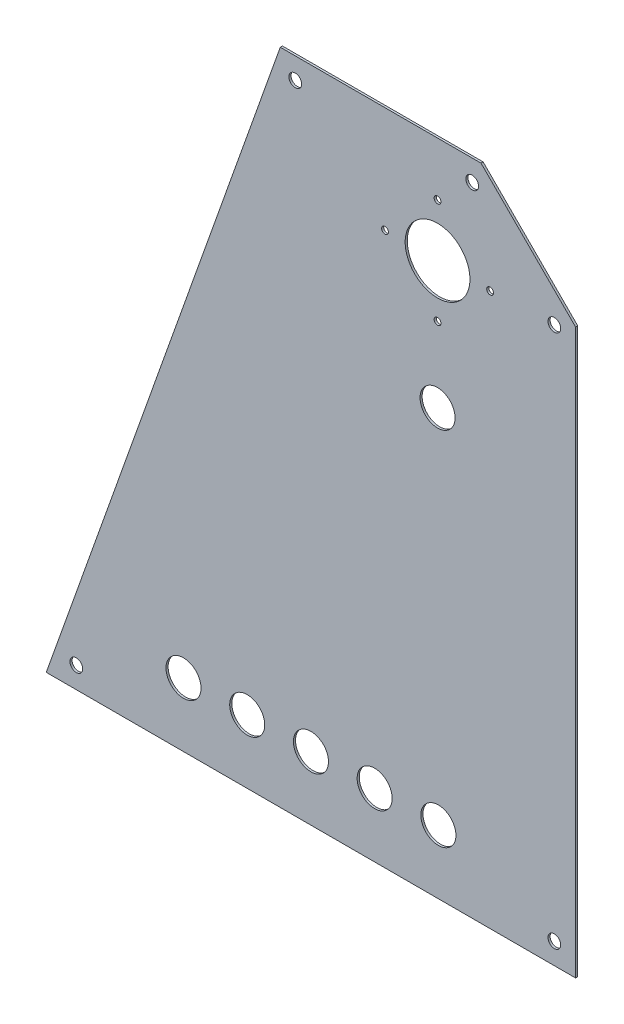
ISO-10303-21;
HEADER;
FILE_DESCRIPTION(('STEP AP214'),'2;1');
FILE_NAME('part.step','',(''),(''),'','','');
FILE_SCHEMA(('AUTOMOTIVE_DESIGN { 1 0 10303 214 1 1 1 1 }'));
ENDSEC;
DATA;
#1=APPLICATION_CONTEXT('core data for automotive mechanical design processes');
#2=APPLICATION_PROTOCOL_DEFINITION('international standard','automotive_design',2000,#1);
#3=PRODUCT_CONTEXT('',#1,'mechanical');
#4=PRODUCT('Part','Part','',(#3));
#5=PRODUCT_RELATED_PRODUCT_CATEGORY('part','',(#4));
#6=PRODUCT_DEFINITION_FORMATION('','',#4);
#7=PRODUCT_DEFINITION_CONTEXT('part definition',#1,'design');
#8=PRODUCT_DEFINITION('design','',#6,#7);
#9=PRODUCT_DEFINITION_SHAPE('','',#8);
#10=(LENGTH_UNIT() NAMED_UNIT(*) SI_UNIT(.MILLI.,.METRE.));
#11=(NAMED_UNIT(*) PLANE_ANGLE_UNIT() SI_UNIT($,.RADIAN.));
#12=(NAMED_UNIT(*) SI_UNIT($,.STERADIAN.) SOLID_ANGLE_UNIT());
#13=UNCERTAINTY_MEASURE_WITH_UNIT(LENGTH_MEASURE(1.E-05),#10,'distance_accuracy_value','');
#14=(GEOMETRIC_REPRESENTATION_CONTEXT(3) GLOBAL_UNCERTAINTY_ASSIGNED_CONTEXT((#13)) GLOBAL_UNIT_ASSIGNED_CONTEXT((#10,
#11,#12)) REPRESENTATION_CONTEXT('',''));
#15=CARTESIAN_POINT('',(0.,0.,0.));
#16=DIRECTION('',(0.,0.,1.));
#17=DIRECTION('',(1.,0.,0.));
#18=AXIS2_PLACEMENT_3D('',#15,#16,#17);
#19=CARTESIAN_POINT('',(125.,155.,-1.));
#20=DIRECTION('',(0.,-1.,0.));
#21=DIRECTION('',(0.,0.,1.));
#22=AXIS2_PLACEMENT_3D('',#19,#20,#21);
#23=PLANE('',#22);
#24=DIRECTION('',(-1.,0.,0.));
#25=VECTOR('',#24,1.);
#26=CARTESIAN_POINT('',(125.,155.,0.));
#27=LINE('',#26,#25);
#28=CARTESIAN_POINT('',(80.4522727852475,155.,0.));
#29=VERTEX_POINT('',#28);
#30=CARTESIAN_POINT('',(-14.0477272147525,155.,0.));
#31=VERTEX_POINT('',#30);
#32=EDGE_CURVE('E93',#29,#31,#27,.T.);
#33=ORIENTED_EDGE('',*,*,#32,.F.);
#34=DIRECTION('',(0.,0.,-1.));
#35=VECTOR('',#34,1.);
#36=CARTESIAN_POINT('',(80.4522727852475,155.,0.));
#37=LINE('',#36,#35);
#38=CARTESIAN_POINT('',(80.4522727852475,155.,-1.));
#39=VERTEX_POINT('',#38);
#40=EDGE_CURVE('E100',#29,#39,#37,.T.);
#41=ORIENTED_EDGE('',*,*,#40,.T.);
#42=DIRECTION('',(-1.,0.,0.));
#43=VECTOR('',#42,1.);
#44=CARTESIAN_POINT('',(125.,155.,-1.));
#45=LINE('',#44,#43);
#46=CARTESIAN_POINT('',(-14.0477272147525,155.,-1.));
#47=VERTEX_POINT('',#46);
#48=EDGE_CURVE('E109',#39,#47,#45,.T.);
#49=ORIENTED_EDGE('',*,*,#48,.T.);
#50=DIRECTION('',(0.,0.,-1.));
#51=VECTOR('',#50,1.);
#52=CARTESIAN_POINT('',(-14.0477272147525,155.,0.));
#53=LINE('',#52,#51);
#54=EDGE_CURVE('E94',#31,#47,#53,.T.);
#55=ORIENTED_EDGE('',*,*,#54,.F.);
#56=EDGE_LOOP('',(#33,#41,#49,#55));
#57=FACE_BOUND('',#56,.T.);
#58=ADVANCED_FACE('F41',(#57),#23,.F.);
#59=CARTESIAN_POINT('',(125.,-155.,-1.));
#60=DIRECTION('',(0.,1.,0.));
#61=DIRECTION('',(0.,0.,-1.));
#62=AXIS2_PLACEMENT_3D('',#59,#60,#61);
#63=PLANE('',#62);
#64=DIRECTION('',(0.,0.,-1.));
#65=VECTOR('',#64,1.);
#66=CARTESIAN_POINT('',(-124.233933247994,-155.,0.));
#67=LINE('',#66,#65);
#68=CARTESIAN_POINT('',(-124.233933247994,-155.,0.));
#69=VERTEX_POINT('',#68);
#70=CARTESIAN_POINT('',(-124.233933247994,-155.,-1.));
#71=VERTEX_POINT('',#70);
#72=EDGE_CURVE('E119',#69,#71,#67,.T.);
#73=ORIENTED_EDGE('',*,*,#72,.T.);
#74=DIRECTION('',(1.,0.,0.));
#75=VECTOR('',#74,1.);
#76=CARTESIAN_POINT('',(125.,-155.,-1.));
#77=LINE('',#76,#75);
#78=CARTESIAN_POINT('',(125.,-155.,-1.));
#79=VERTEX_POINT('',#78);
#80=EDGE_CURVE('E112',#71,#79,#77,.T.);
#81=ORIENTED_EDGE('',*,*,#80,.T.);
#82=DIRECTION('',(0.,0.,1.));
#83=VECTOR('',#82,1.);
#84=CARTESIAN_POINT('',(125.,-155.,-1.));
#85=LINE('',#84,#83);
#86=CARTESIAN_POINT('',(125.,-155.,0.));
#87=VERTEX_POINT('',#86);
#88=EDGE_CURVE('E11',#79,#87,#85,.T.);
#89=ORIENTED_EDGE('',*,*,#88,.T.);
#90=DIRECTION('',(1.,0.,0.));
#91=VECTOR('',#90,1.);
#92=CARTESIAN_POINT('',(125.,-155.,0.));
#93=LINE('',#92,#91);
#94=EDGE_CURVE('E104',#69,#87,#93,.T.);
#95=ORIENTED_EDGE('',*,*,#94,.F.);
#96=EDGE_LOOP('',(#73,#81,#89,#95));
#97=FACE_BOUND('',#96,.T.);
#98=ADVANCED_FACE('F280',(#97),#63,.F.);
#99=CARTESIAN_POINT('',(125.,-155.,-1.));
#100=DIRECTION('',(-1.,0.,0.));
#101=DIRECTION('',(0.,0.,-1.));
#102=AXIS2_PLACEMENT_3D('',#99,#100,#101);
#103=PLANE('',#102);
#104=DIRECTION('',(0.,1.,0.));
#105=VECTOR('',#104,1.);
#106=CARTESIAN_POINT('',(125.,-155.,0.));
#107=LINE('',#106,#105);
#108=CARTESIAN_POINT('',(125.,110.452272785248,0.));
#109=VERTEX_POINT('',#108);
#110=EDGE_CURVE('E91',#87,#109,#107,.T.);
#111=ORIENTED_EDGE('',*,*,#110,.F.);
#112=ORIENTED_EDGE('',*,*,#88,.F.);
#113=DIRECTION('',(0.,1.,0.));
#114=VECTOR('',#113,1.);
#115=CARTESIAN_POINT('',(125.,-155.,-1.));
#116=LINE('',#115,#114);
#117=CARTESIAN_POINT('',(125.,110.452272785248,-1.));
#118=VERTEX_POINT('',#117);
#119=EDGE_CURVE('E48',#79,#118,#116,.T.);
#120=ORIENTED_EDGE('',*,*,#119,.T.);
#121=DIRECTION('',(0.,0.,-1.));
#122=VECTOR('',#121,1.);
#123=CARTESIAN_POINT('',(125.,110.452272785248,0.));
#124=LINE('',#123,#122);
#125=EDGE_CURVE('E103',#109,#118,#124,.T.);
#126=ORIENTED_EDGE('',*,*,#125,.F.);
#127=EDGE_LOOP('',(#111,#112,#120,#126));
#128=FACE_BOUND('',#127,.T.);
#129=ADVANCED_FACE('F268',(#128),#103,.F.);
#130=CARTESIAN_POINT('',(0.,0.,-1.));
#131=DIRECTION('',(0.,0.,1.));
#132=DIRECTION('',(-1.,0.,0.));
#133=AXIS2_PLACEMENT_3D('',#130,#131,#132);
#134=PLANE('',#133);
#135=CARTESIAN_POINT('',(-110.06663627918,-145.,-1.));
#136=DIRECTION('',(0.,0.,1.));
#137=DIRECTION('',(1.,0.,0.));
#138=AXIS2_PLACEMENT_3D('',#135,#136,#137);
#139=CIRCLE('',#138,2.99999999999999);
#140=CARTESIAN_POINT('',(-107.06663627918,-145.,-1.));
#141=VERTEX_POINT('',#140);
#142=EDGE_CURVE('E214',#141,#141,#139,.T.);
#143=ORIENTED_EDGE('',*,*,#142,.T.);
#144=EDGE_LOOP('',(#143));
#145=FACE_BOUND('',#144,.T.);
#146=CARTESIAN_POINT('',(-6.98921773195385,145.,-1.));
#147=DIRECTION('',(0.,0.,1.));
#148=DIRECTION('',(1.,0.,0.));
#149=AXIS2_PLACEMENT_3D('',#146,#147,#148);
#150=CIRCLE('',#149,2.99999999999999);
#151=CARTESIAN_POINT('',(-3.98921773195385,145.,-1.));
#152=VERTEX_POINT('',#151);
#153=EDGE_CURVE('E215',#152,#152,#150,.T.);
#154=ORIENTED_EDGE('',*,*,#153,.T.);
#155=EDGE_LOOP('',(#154));
#156=FACE_BOUND('',#155,.T.);
#157=CARTESIAN_POINT('',(76.3101371615166,145.,-1.));
#158=DIRECTION('',(0.,0.,1.));
#159=DIRECTION('',(1.,0.,0.));
#160=AXIS2_PLACEMENT_3D('',#157,#158,#159);
#161=CIRCLE('',#160,2.99999999999999);
#162=CARTESIAN_POINT('',(79.3101371615166,145.,-1.));
#163=VERTEX_POINT('',#162);
#164=EDGE_CURVE('E206',#163,#163,#161,.T.);
#165=ORIENTED_EDGE('',*,*,#164,.T.);
#166=EDGE_LOOP('',(#165));
#167=FACE_BOUND('',#166,.T.);
#168=CARTESIAN_POINT('',(115.,-145.,-1.));
#169=DIRECTION('',(0.,0.,1.));
#170=DIRECTION('',(1.,0.,0.));
#171=AXIS2_PLACEMENT_3D('',#168,#169,#170);
#172=CIRCLE('',#171,2.99999999999999);
#173=CARTESIAN_POINT('',(118.,-145.,-1.));
#174=VERTEX_POINT('',#173);
#175=EDGE_CURVE('E199',#174,#174,#172,.T.);
#176=ORIENTED_EDGE('',*,*,#175,.T.);
#177=EDGE_LOOP('',(#176));
#178=FACE_BOUND('',#177,.T.);
#179=CARTESIAN_POINT('',(115.,106.310137161517,-1.));
#180=DIRECTION('',(0.,0.,1.));
#181=DIRECTION('',(1.,0.,0.));
#182=AXIS2_PLACEMENT_3D('',#179,#180,#181);
#183=CIRCLE('',#182,3.00000000000001);
#184=CARTESIAN_POINT('',(118.,106.310137161517,-1.));
#185=VERTEX_POINT('',#184);
#186=EDGE_CURVE('E193',#185,#185,#183,.T.);
#187=ORIENTED_EDGE('',*,*,#186,.T.);
#188=EDGE_LOOP('',(#187));
#189=FACE_BOUND('',#188,.T.);
#190=CARTESIAN_POINT('',(-59.6169666239971,-125.,-1.));
#191=DIRECTION('',(0.,0.,1.));
#192=DIRECTION('',(1.,0.,0.));
#193=AXIS2_PLACEMENT_3D('',#190,#191,#192);
#194=CIRCLE('',#193,8.25);
#195=CARTESIAN_POINT('',(-51.3669666239971,-125.,-1.));
#196=VERTEX_POINT('',#195);
#197=EDGE_CURVE('E189',#196,#196,#194,.T.);
#198=ORIENTED_EDGE('',*,*,#197,.T.);
#199=EDGE_LOOP('',(#198));
#200=FACE_BOUND('',#199,.T.);
#201=CARTESIAN_POINT('',(-29.6169666239971,-125.,-1.));
#202=DIRECTION('',(0.,0.,1.));
#203=DIRECTION('',(1.,0.,0.));
#204=AXIS2_PLACEMENT_3D('',#201,#202,#203);
#205=CIRCLE('',#204,8.25);
#206=CARTESIAN_POINT('',(-21.3669666239971,-125.,-1.));
#207=VERTEX_POINT('',#206);
#208=EDGE_CURVE('E181',#207,#207,#205,.T.);
#209=ORIENTED_EDGE('',*,*,#208,.T.);
#210=EDGE_LOOP('',(#209));
#211=FACE_BOUND('',#210,.T.);
#212=CARTESIAN_POINT('',(0.383033376002859,-125.,-1.));
#213=DIRECTION('',(0.,0.,1.));
#214=DIRECTION('',(1.,0.,0.));
#215=AXIS2_PLACEMENT_3D('',#212,#213,#214);
#216=CIRCLE('',#215,8.25);
#217=CARTESIAN_POINT('',(8.63303337600286,-125.,-1.));
#218=VERTEX_POINT('',#217);
#219=EDGE_CURVE('E180',#218,#218,#216,.T.);
#220=ORIENTED_EDGE('',*,*,#219,.T.);
#221=EDGE_LOOP('',(#220));
#222=FACE_BOUND('',#221,.T.);
#223=CARTESIAN_POINT('',(30.3830333760029,-125.,-1.));
#224=DIRECTION('',(0.,0.,1.));
#225=DIRECTION('',(1.,0.,0.));
#226=AXIS2_PLACEMENT_3D('',#223,#224,#225);
#227=CIRCLE('',#226,8.25);
#228=CARTESIAN_POINT('',(38.6330333760028,-125.,-1.));
#229=VERTEX_POINT('',#228);
#230=EDGE_CURVE('E174',#229,#229,#227,.T.);
#231=ORIENTED_EDGE('',*,*,#230,.T.);
#232=EDGE_LOOP('',(#231));
#233=FACE_BOUND('',#232,.T.);
#234=CARTESIAN_POINT('',(60.3830333760029,-125.,-1.));
#235=DIRECTION('',(0.,0.,1.));
#236=DIRECTION('',(1.,0.,0.));
#237=AXIS2_PLACEMENT_3D('',#234,#235,#236);
#238=CIRCLE('',#237,8.25);
#239=CARTESIAN_POINT('',(68.6330333760029,-125.,-1.));
#240=VERTEX_POINT('',#239);
#241=EDGE_CURVE('E163',#240,#240,#238,.T.);
#242=ORIENTED_EDGE('',*,*,#241,.T.);
#243=EDGE_LOOP('',(#242));
#244=FACE_BOUND('',#243,.T.);
#245=CARTESIAN_POINT('',(35.2512626584709,105.,-1.));
#246=DIRECTION('',(0.,0.,1.));
#247=DIRECTION('',(1.,0.,0.));
#248=AXIS2_PLACEMENT_3D('',#245,#246,#247);
#249=CIRCLE('',#248,1.60000000000001);
#250=CARTESIAN_POINT('',(36.8512626584709,105.,-1.));
#251=VERTEX_POINT('',#250);
#252=EDGE_CURVE('E148',#251,#251,#249,.T.);
#253=ORIENTED_EDGE('',*,*,#252,.T.);
#254=EDGE_LOOP('',(#253));
#255=FACE_BOUND('',#254,.T.);
#256=CARTESIAN_POINT('',(84.7487373415291,105.,-1.));
#257=DIRECTION('',(0.,0.,1.));
#258=DIRECTION('',(1.,0.,0.));
#259=AXIS2_PLACEMENT_3D('',#256,#257,#258);
#260=CIRCLE('',#259,1.59999999999993);
#261=CARTESIAN_POINT('',(86.348737341529,105.,-1.));
#262=VERTEX_POINT('',#261);
#263=EDGE_CURVE('E132',#262,#262,#260,.T.);
#264=ORIENTED_EDGE('',*,*,#263,.T.);
#265=EDGE_LOOP('',(#264));
#266=FACE_BOUND('',#265,.T.);
#267=CARTESIAN_POINT('',(60.,129.748737341529,-1.));
#268=DIRECTION('',(0.,0.,1.));
#269=DIRECTION('',(1.,0.,0.));
#270=AXIS2_PLACEMENT_3D('',#267,#268,#269);
#271=CIRCLE('',#270,1.59999999999999);
#272=CARTESIAN_POINT('',(61.6,129.748737341529,-1.));
#273=VERTEX_POINT('',#272);
#274=EDGE_CURVE('E133',#273,#273,#271,.T.);
#275=ORIENTED_EDGE('',*,*,#274,.T.);
#276=EDGE_LOOP('',(#275));
#277=FACE_BOUND('',#276,.T.);
#278=CARTESIAN_POINT('',(60.,45.,-1.));
#279=DIRECTION('',(0.,0.,1.));
#280=DIRECTION('',(1.,0.,0.));
#281=AXIS2_PLACEMENT_3D('',#278,#279,#280);
#282=CIRCLE('',#281,8.25);
#283=CARTESIAN_POINT('',(68.25,45.,-1.));
#284=VERTEX_POINT('',#283);
#285=EDGE_CURVE('E126',#284,#284,#282,.T.);
#286=ORIENTED_EDGE('',*,*,#285,.T.);
#287=EDGE_LOOP('',(#286));
#288=FACE_BOUND('',#287,.T.);
#289=CARTESIAN_POINT('',(59.9999999999999,80.2512626584708,-1.));
#290=DIRECTION('',(0.,0.,1.));
#291=DIRECTION('',(1.,0.,0.));
#292=AXIS2_PLACEMENT_3D('',#289,#290,#291);
#293=CIRCLE('',#292,1.60000000000005);
#294=CARTESIAN_POINT('',(61.6,80.2512626584708,-1.));
#295=VERTEX_POINT('',#294);
#296=EDGE_CURVE('E150',#295,#295,#293,.T.);
#297=ORIENTED_EDGE('',*,*,#296,.T.);
#298=EDGE_LOOP('',(#297));
#299=FACE_BOUND('',#298,.T.);
#300=CARTESIAN_POINT('',(60.,105.,-1.));
#301=DIRECTION('',(0.,0.,1.));
#302=DIRECTION('',(1.,0.,0.));
#303=AXIS2_PLACEMENT_3D('',#300,#301,#302);
#304=CIRCLE('',#303,15.25);
#305=CARTESIAN_POINT('',(75.25,105.,-1.));
#306=VERTEX_POINT('',#305);
#307=EDGE_CURVE('E124',#306,#306,#304,.T.);
#308=ORIENTED_EDGE('',*,*,#307,.T.);
#309=EDGE_LOOP('',(#308));
#310=FACE_BOUND('',#309,.T.);
#311=ORIENTED_EDGE('',*,*,#119,.F.);
#312=ORIENTED_EDGE('',*,*,#80,.F.);
#313=DIRECTION('',(-0.3349124803442,-0.942249240121581,0.));
#314=VECTOR('',#313,1.);
#315=CARTESIAN_POINT('',(-14.0477272147525,155.,-1.));
#316=LINE('',#315,#314);
#317=EDGE_CURVE('E121',#47,#71,#316,.T.);
#318=ORIENTED_EDGE('',*,*,#317,.F.);
#319=ORIENTED_EDGE('',*,*,#48,.F.);
#320=DIRECTION('',(-0.707106781186547,0.707106781186547,0.));
#321=VECTOR('',#320,1.);
#322=CARTESIAN_POINT('',(125.,110.452272785248,-1.));
#323=LINE('',#322,#321);
#324=EDGE_CURVE('E97',#118,#39,#323,.T.);
#325=ORIENTED_EDGE('',*,*,#324,.F.);
#326=EDGE_LOOP('',(#311,#312,#318,#319,#325));
#327=FACE_BOUND('',#326,.T.);
#328=ADVANCED_FACE('F226',(#145,#156,#167,#178,#189,#200,#211,#222,#233,#244,#255,#266,#277,
#288,#299,#310,#327),#134,.F.);
#329=CARTESIAN_POINT('',(0.,0.,0.));
#330=DIRECTION('',(0.,0.,1.));
#331=DIRECTION('',(-1.,0.,0.));
#332=AXIS2_PLACEMENT_3D('',#329,#330,#331);
#333=PLANE('',#332);
#334=CARTESIAN_POINT('',(-110.06663627918,-145.,0.));
#335=DIRECTION('',(0.,0.,1.));
#336=DIRECTION('',(1.,0.,0.));
#337=AXIS2_PLACEMENT_3D('',#334,#335,#336);
#338=CIRCLE('',#337,2.99999999999999);
#339=CARTESIAN_POINT('',(-107.06663627918,-145.,0.));
#340=VERTEX_POINT('',#339);
#341=EDGE_CURVE('E164',#340,#340,#338,.T.);
#342=ORIENTED_EDGE('',*,*,#341,.F.);
#343=EDGE_LOOP('',(#342));
#344=FACE_BOUND('',#343,.T.);
#345=CARTESIAN_POINT('',(-6.98921773195385,145.,0.));
#346=DIRECTION('',(0.,0.,1.));
#347=DIRECTION('',(1.,0.,0.));
#348=AXIS2_PLACEMENT_3D('',#345,#346,#347);
#349=CIRCLE('',#348,2.99999999999999);
#350=CARTESIAN_POINT('',(-3.98921773195385,145.,0.));
#351=VERTEX_POINT('',#350);
#352=EDGE_CURVE('E207',#351,#351,#349,.T.);
#353=ORIENTED_EDGE('',*,*,#352,.F.);
#354=EDGE_LOOP('',(#353));
#355=FACE_BOUND('',#354,.T.);
#356=CARTESIAN_POINT('',(76.3101371615166,145.,0.));
#357=DIRECTION('',(0.,0.,1.));
#358=DIRECTION('',(1.,0.,0.));
#359=AXIS2_PLACEMENT_3D('',#356,#357,#358);
#360=CIRCLE('',#359,2.99999999999999);
#361=CARTESIAN_POINT('',(79.3101371615166,145.,0.));
#362=VERTEX_POINT('',#361);
#363=EDGE_CURVE('E201',#362,#362,#360,.T.);
#364=ORIENTED_EDGE('',*,*,#363,.F.);
#365=EDGE_LOOP('',(#364));
#366=FACE_BOUND('',#365,.T.);
#367=CARTESIAN_POINT('',(115.,-145.,0.));
#368=DIRECTION('',(0.,0.,1.));
#369=DIRECTION('',(1.,0.,0.));
#370=AXIS2_PLACEMENT_3D('',#367,#368,#369);
#371=CIRCLE('',#370,2.99999999999999);
#372=CARTESIAN_POINT('',(118.,-145.,0.));
#373=VERTEX_POINT('',#372);
#374=EDGE_CURVE('E197',#373,#373,#371,.T.);
#375=ORIENTED_EDGE('',*,*,#374,.F.);
#376=EDGE_LOOP('',(#375));
#377=FACE_BOUND('',#376,.T.);
#378=CARTESIAN_POINT('',(115.,106.310137161517,0.));
#379=DIRECTION('',(0.,0.,1.));
#380=DIRECTION('',(1.,0.,0.));
#381=AXIS2_PLACEMENT_3D('',#378,#379,#380);
#382=CIRCLE('',#381,3.00000000000001);
#383=CARTESIAN_POINT('',(118.,106.310137161517,0.));
#384=VERTEX_POINT('',#383);
#385=EDGE_CURVE('E191',#384,#384,#382,.T.);
#386=ORIENTED_EDGE('',*,*,#385,.F.);
#387=EDGE_LOOP('',(#386));
#388=FACE_BOUND('',#387,.T.);
#389=CARTESIAN_POINT('',(-59.6169666239971,-125.,0.));
#390=DIRECTION('',(0.,0.,1.));
#391=DIRECTION('',(1.,0.,0.));
#392=AXIS2_PLACEMENT_3D('',#389,#390,#391);
#393=CIRCLE('',#392,8.25);
#394=CARTESIAN_POINT('',(-51.3669666239971,-125.,0.));
#395=VERTEX_POINT('',#394);
#396=EDGE_CURVE('E158',#395,#395,#393,.T.);
#397=ORIENTED_EDGE('',*,*,#396,.F.);
#398=EDGE_LOOP('',(#397));
#399=FACE_BOUND('',#398,.T.);
#400=CARTESIAN_POINT('',(-29.6169666239971,-125.,0.));
#401=DIRECTION('',(0.,0.,1.));
#402=DIRECTION('',(1.,0.,0.));
#403=AXIS2_PLACEMENT_3D('',#400,#401,#402);
#404=CIRCLE('',#403,8.25);
#405=CARTESIAN_POINT('',(-21.3669666239971,-125.,0.));
#406=VERTEX_POINT('',#405);
#407=EDGE_CURVE('E179',#406,#406,#404,.T.);
#408=ORIENTED_EDGE('',*,*,#407,.F.);
#409=EDGE_LOOP('',(#408));
#410=FACE_BOUND('',#409,.T.);
#411=CARTESIAN_POINT('',(0.383033376002859,-125.,0.));
#412=DIRECTION('',(0.,0.,1.));
#413=DIRECTION('',(1.,0.,0.));
#414=AXIS2_PLACEMENT_3D('',#411,#412,#413);
#415=CIRCLE('',#414,8.25);
#416=CARTESIAN_POINT('',(8.63303337600286,-125.,0.));
#417=VERTEX_POINT('',#416);
#418=EDGE_CURVE('E173',#417,#417,#415,.T.);
#419=ORIENTED_EDGE('',*,*,#418,.F.);
#420=EDGE_LOOP('',(#419));
#421=FACE_BOUND('',#420,.T.);
#422=CARTESIAN_POINT('',(30.3830333760029,-125.,0.));
#423=DIRECTION('',(0.,0.,1.));
#424=DIRECTION('',(1.,0.,0.));
#425=AXIS2_PLACEMENT_3D('',#422,#423,#424);
#426=CIRCLE('',#425,8.25);
#427=CARTESIAN_POINT('',(38.6330333760028,-125.,0.));
#428=VERTEX_POINT('',#427);
#429=EDGE_CURVE('E169',#428,#428,#426,.T.);
#430=ORIENTED_EDGE('',*,*,#429,.F.);
#431=EDGE_LOOP('',(#430));
#432=FACE_BOUND('',#431,.T.);
#433=CARTESIAN_POINT('',(60.3830333760029,-125.,0.));
#434=DIRECTION('',(0.,0.,1.));
#435=DIRECTION('',(1.,0.,0.));
#436=AXIS2_PLACEMENT_3D('',#433,#434,#435);
#437=CIRCLE('',#436,8.25);
#438=CARTESIAN_POINT('',(68.6330333760029,-125.,0.));
#439=VERTEX_POINT('',#438);
#440=EDGE_CURVE('E161',#439,#439,#437,.T.);
#441=ORIENTED_EDGE('',*,*,#440,.F.);
#442=EDGE_LOOP('',(#441));
#443=FACE_BOUND('',#442,.T.);
#444=CARTESIAN_POINT('',(35.2512626584709,105.,0.));
#445=DIRECTION('',(0.,0.,1.));
#446=DIRECTION('',(1.,0.,0.));
#447=AXIS2_PLACEMENT_3D('',#444,#445,#446);
#448=CIRCLE('',#447,1.60000000000001);
#449=CARTESIAN_POINT('',(36.8512626584709,105.,0.));
#450=VERTEX_POINT('',#449);
#451=EDGE_CURVE('E141',#450,#450,#448,.T.);
#452=ORIENTED_EDGE('',*,*,#451,.F.);
#453=EDGE_LOOP('',(#452));
#454=FACE_BOUND('',#453,.T.);
#455=CARTESIAN_POINT('',(84.7487373415291,105.,0.));
#456=DIRECTION('',(0.,0.,1.));
#457=DIRECTION('',(1.,0.,0.));
#458=AXIS2_PLACEMENT_3D('',#455,#456,#457);
#459=CIRCLE('',#458,1.59999999999993);
#460=CARTESIAN_POINT('',(86.348737341529,105.,0.));
#461=VERTEX_POINT('',#460);
#462=EDGE_CURVE('E147',#461,#461,#459,.T.);
#463=ORIENTED_EDGE('',*,*,#462,.F.);
#464=EDGE_LOOP('',(#463));
#465=FACE_BOUND('',#464,.T.);
#466=CARTESIAN_POINT('',(60.,129.748737341529,0.));
#467=DIRECTION('',(0.,0.,1.));
#468=DIRECTION('',(1.,0.,0.));
#469=AXIS2_PLACEMENT_3D('',#466,#467,#468);
#470=CIRCLE('',#469,1.59999999999999);
#471=CARTESIAN_POINT('',(61.6,129.748737341529,0.));
#472=VERTEX_POINT('',#471);
#473=EDGE_CURVE('E134',#472,#472,#470,.T.);
#474=ORIENTED_EDGE('',*,*,#473,.F.);
#475=EDGE_LOOP('',(#474));
#476=FACE_BOUND('',#475,.T.);
#477=CARTESIAN_POINT('',(60.,45.,0.));
#478=DIRECTION('',(0.,0.,1.));
#479=DIRECTION('',(1.,0.,0.));
#480=AXIS2_PLACEMENT_3D('',#477,#478,#479);
#481=CIRCLE('',#480,8.25);
#482=CARTESIAN_POINT('',(68.25,45.,0.));
#483=VERTEX_POINT('',#482);
#484=EDGE_CURVE('E137',#483,#483,#481,.T.);
#485=ORIENTED_EDGE('',*,*,#484,.F.);
#486=EDGE_LOOP('',(#485));
#487=FACE_BOUND('',#486,.T.);
#488=CARTESIAN_POINT('',(59.9999999999999,80.2512626584708,0.));
#489=DIRECTION('',(0.,0.,1.));
#490=DIRECTION('',(1.,0.,0.));
#491=AXIS2_PLACEMENT_3D('',#488,#489,#490);
#492=CIRCLE('',#491,1.60000000000005);
#493=CARTESIAN_POINT('',(61.6,80.2512626584708,0.));
#494=VERTEX_POINT('',#493);
#495=EDGE_CURVE('E154',#494,#494,#492,.T.);
#496=ORIENTED_EDGE('',*,*,#495,.F.);
#497=EDGE_LOOP('',(#496));
#498=FACE_BOUND('',#497,.T.);
#499=CARTESIAN_POINT('',(60.,105.,0.));
#500=DIRECTION('',(0.,0.,1.));
#501=DIRECTION('',(1.,0.,0.));
#502=AXIS2_PLACEMENT_3D('',#499,#500,#501);
#503=CIRCLE('',#502,15.25);
#504=CARTESIAN_POINT('',(75.25,105.,0.));
#505=VERTEX_POINT('',#504);
#506=EDGE_CURVE('E125',#505,#505,#503,.T.);
#507=ORIENTED_EDGE('',*,*,#506,.F.);
#508=EDGE_LOOP('',(#507));
#509=FACE_BOUND('',#508,.T.);
#510=DIRECTION('',(-0.707106781186547,0.707106781186547,0.));
#511=VECTOR('',#510,1.);
#512=CARTESIAN_POINT('',(125.,110.452272785248,0.));
#513=LINE('',#512,#511);
#514=EDGE_CURVE('E65',#109,#29,#513,.T.);
#515=ORIENTED_EDGE('',*,*,#514,.T.);
#516=ORIENTED_EDGE('',*,*,#32,.T.);
#517=DIRECTION('',(-0.3349124803442,-0.942249240121581,0.));
#518=VECTOR('',#517,1.);
#519=CARTESIAN_POINT('',(-14.0477272147525,155.,0.));
#520=LINE('',#519,#518);
#521=EDGE_CURVE('E54',#31,#69,#520,.T.);
#522=ORIENTED_EDGE('',*,*,#521,.T.);
#523=ORIENTED_EDGE('',*,*,#94,.T.);
#524=ORIENTED_EDGE('',*,*,#110,.T.);
#525=EDGE_LOOP('',(#515,#516,#522,#523,#524));
#526=FACE_BOUND('',#525,.T.);
#527=ADVANCED_FACE('F90',(#344,#355,#366,#377,#388,#399,#410,#421,#432,#443,#454,#465,#476,#487,
#498,#509,#526),#333,.T.);
#528=CARTESIAN_POINT('',(-14.0477272147525,155.,0.));
#529=DIRECTION('',(-0.942249240121581,0.3349124803442,0.));
#530=DIRECTION('',(-0.3349124803442,-0.942249240121581,0.));
#531=AXIS2_PLACEMENT_3D('',#528,#529,#530);
#532=PLANE('',#531);
#533=ORIENTED_EDGE('',*,*,#317,.T.);
#534=ORIENTED_EDGE('',*,*,#72,.F.);
#535=ORIENTED_EDGE('',*,*,#521,.F.);
#536=ORIENTED_EDGE('',*,*,#54,.T.);
#537=EDGE_LOOP('',(#533,#534,#535,#536));
#538=FACE_BOUND('',#537,.T.);
#539=ADVANCED_FACE('F229',(#538),#532,.T.);
#540=CARTESIAN_POINT('',(125.,110.452272785248,0.));
#541=DIRECTION('',(0.707106781186547,0.707106781186547,0.));
#542=DIRECTION('',(-0.707106781186548,0.707106781186548,0.));
#543=AXIS2_PLACEMENT_3D('',#540,#541,#542);
#544=PLANE('',#543);
#545=ORIENTED_EDGE('',*,*,#324,.T.);
#546=ORIENTED_EDGE('',*,*,#40,.F.);
#547=ORIENTED_EDGE('',*,*,#514,.F.);
#548=ORIENTED_EDGE('',*,*,#125,.T.);
#549=EDGE_LOOP('',(#545,#546,#547,#548));
#550=FACE_BOUND('',#549,.T.);
#551=ADVANCED_FACE('F98',(#550),#544,.T.);
#552=CARTESIAN_POINT('',(60.,105.,0.));
#553=DIRECTION('',(0.,0.,-1.));
#554=DIRECTION('',(1.,0.,0.));
#555=AXIS2_PLACEMENT_3D('',#552,#553,#554);
#556=CYLINDRICAL_SURFACE('',#555,15.25);
#557=ORIENTED_EDGE('',*,*,#506,.T.);
#558=EDGE_LOOP('',(#557));
#559=FACE_BOUND('',#558,.T.);
#560=ORIENTED_EDGE('',*,*,#307,.F.);
#561=EDGE_LOOP('',(#560));
#562=FACE_BOUND('',#561,.T.);
#563=ADVANCED_FACE('F259',(#559,#562),#556,.F.);
#564=CARTESIAN_POINT('',(59.9999999999999,80.2512626584708,0.));
#565=DIRECTION('',(0.,0.,-1.));
#566=DIRECTION('',(1.,0.,0.));
#567=AXIS2_PLACEMENT_3D('',#564,#565,#566);
#568=CYLINDRICAL_SURFACE('',#567,1.60000000000005);
#569=ORIENTED_EDGE('',*,*,#495,.T.);
#570=EDGE_LOOP('',(#569));
#571=FACE_BOUND('',#570,.T.);
#572=ORIENTED_EDGE('',*,*,#296,.F.);
#573=EDGE_LOOP('',(#572));
#574=FACE_BOUND('',#573,.T.);
#575=ADVANCED_FACE('F265',(#571,#574),#568,.F.);
#576=CARTESIAN_POINT('',(60.,45.,0.));
#577=DIRECTION('',(0.,0.,-1.));
#578=DIRECTION('',(1.,0.,0.));
#579=AXIS2_PLACEMENT_3D('',#576,#577,#578);
#580=CYLINDRICAL_SURFACE('',#579,8.25);
#581=ORIENTED_EDGE('',*,*,#484,.T.);
#582=EDGE_LOOP('',(#581));
#583=FACE_BOUND('',#582,.T.);
#584=ORIENTED_EDGE('',*,*,#285,.F.);
#585=EDGE_LOOP('',(#584));
#586=FACE_BOUND('',#585,.T.);
#587=ADVANCED_FACE('F332',(#583,#586),#580,.F.);
#588=CARTESIAN_POINT('',(60.,129.748737341529,0.));
#589=DIRECTION('',(0.,0.,-1.));
#590=DIRECTION('',(1.,0.,0.));
#591=AXIS2_PLACEMENT_3D('',#588,#589,#590);
#592=CYLINDRICAL_SURFACE('',#591,1.59999999999999);
#593=ORIENTED_EDGE('',*,*,#473,.T.);
#594=EDGE_LOOP('',(#593));
#595=FACE_BOUND('',#594,.T.);
#596=ORIENTED_EDGE('',*,*,#274,.F.);
#597=EDGE_LOOP('',(#596));
#598=FACE_BOUND('',#597,.T.);
#599=ADVANCED_FACE('F341',(#595,#598),#592,.F.);
#600=CARTESIAN_POINT('',(84.7487373415291,105.,0.));
#601=DIRECTION('',(0.,0.,-1.));
#602=DIRECTION('',(1.,0.,0.));
#603=AXIS2_PLACEMENT_3D('',#600,#601,#602);
#604=CYLINDRICAL_SURFACE('',#603,1.59999999999993);
#605=ORIENTED_EDGE('',*,*,#462,.T.);
#606=EDGE_LOOP('',(#605));
#607=FACE_BOUND('',#606,.T.);
#608=ORIENTED_EDGE('',*,*,#263,.F.);
#609=EDGE_LOOP('',(#608));
#610=FACE_BOUND('',#609,.T.);
#611=ADVANCED_FACE('F354',(#607,#610),#604,.F.);
#612=CARTESIAN_POINT('',(35.2512626584709,105.,0.));
#613=DIRECTION('',(0.,0.,-1.));
#614=DIRECTION('',(1.,0.,0.));
#615=AXIS2_PLACEMENT_3D('',#612,#613,#614);
#616=CYLINDRICAL_SURFACE('',#615,1.60000000000001);
#617=ORIENTED_EDGE('',*,*,#451,.T.);
#618=EDGE_LOOP('',(#617));
#619=FACE_BOUND('',#618,.T.);
#620=ORIENTED_EDGE('',*,*,#252,.F.);
#621=EDGE_LOOP('',(#620));
#622=FACE_BOUND('',#621,.T.);
#623=ADVANCED_FACE('F363',(#619,#622),#616,.F.);
#624=CARTESIAN_POINT('',(60.3830333760029,-125.,0.));
#625=DIRECTION('',(0.,0.,-1.));
#626=DIRECTION('',(1.,0.,0.));
#627=AXIS2_PLACEMENT_3D('',#624,#625,#626);
#628=CYLINDRICAL_SURFACE('',#627,8.25);
#629=ORIENTED_EDGE('',*,*,#440,.T.);
#630=EDGE_LOOP('',(#629));
#631=FACE_BOUND('',#630,.T.);
#632=ORIENTED_EDGE('',*,*,#241,.F.);
#633=EDGE_LOOP('',(#632));
#634=FACE_BOUND('',#633,.T.);
#635=ADVANCED_FACE('F371',(#631,#634),#628,.F.);
#636=CARTESIAN_POINT('',(30.3830333760029,-125.,0.));
#637=DIRECTION('',(0.,0.,-1.));
#638=DIRECTION('',(1.,0.,0.));
#639=AXIS2_PLACEMENT_3D('',#636,#637,#638);
#640=CYLINDRICAL_SURFACE('',#639,8.25);
#641=ORIENTED_EDGE('',*,*,#429,.T.);
#642=EDGE_LOOP('',(#641));
#643=FACE_BOUND('',#642,.T.);
#644=ORIENTED_EDGE('',*,*,#230,.F.);
#645=EDGE_LOOP('',(#644));
#646=FACE_BOUND('',#645,.T.);
#647=ADVANCED_FACE('F381',(#643,#646),#640,.F.);
#648=CARTESIAN_POINT('',(0.383033376002859,-125.,0.));
#649=DIRECTION('',(0.,0.,-1.));
#650=DIRECTION('',(1.,0.,0.));
#651=AXIS2_PLACEMENT_3D('',#648,#649,#650);
#652=CYLINDRICAL_SURFACE('',#651,8.25);
#653=ORIENTED_EDGE('',*,*,#418,.T.);
#654=EDGE_LOOP('',(#653));
#655=FACE_BOUND('',#654,.T.);
#656=ORIENTED_EDGE('',*,*,#219,.F.);
#657=EDGE_LOOP('',(#656));
#658=FACE_BOUND('',#657,.T.);
#659=ADVANCED_FACE('F394',(#655,#658),#652,.F.);
#660=CARTESIAN_POINT('',(-29.6169666239971,-125.,0.));
#661=DIRECTION('',(0.,0.,-1.));
#662=DIRECTION('',(1.,0.,0.));
#663=AXIS2_PLACEMENT_3D('',#660,#661,#662);
#664=CYLINDRICAL_SURFACE('',#663,8.25);
#665=ORIENTED_EDGE('',*,*,#407,.T.);
#666=EDGE_LOOP('',(#665));
#667=FACE_BOUND('',#666,.T.);
#668=ORIENTED_EDGE('',*,*,#208,.F.);
#669=EDGE_LOOP('',(#668));
#670=FACE_BOUND('',#669,.T.);
#671=ADVANCED_FACE('F402',(#667,#670),#664,.F.);
#672=CARTESIAN_POINT('',(-59.6169666239971,-125.,0.));
#673=DIRECTION('',(0.,0.,-1.));
#674=DIRECTION('',(1.,0.,0.));
#675=AXIS2_PLACEMENT_3D('',#672,#673,#674);
#676=CYLINDRICAL_SURFACE('',#675,8.25);
#677=ORIENTED_EDGE('',*,*,#396,.T.);
#678=EDGE_LOOP('',(#677));
#679=FACE_BOUND('',#678,.T.);
#680=ORIENTED_EDGE('',*,*,#197,.F.);
#681=EDGE_LOOP('',(#680));
#682=FACE_BOUND('',#681,.T.);
#683=ADVANCED_FACE('F411',(#679,#682),#676,.F.);
#684=CARTESIAN_POINT('',(115.,106.310137161517,0.));
#685=DIRECTION('',(0.,0.,-1.));
#686=DIRECTION('',(1.,0.,0.));
#687=AXIS2_PLACEMENT_3D('',#684,#685,#686);
#688=CYLINDRICAL_SURFACE('',#687,3.00000000000001);
#689=ORIENTED_EDGE('',*,*,#385,.T.);
#690=EDGE_LOOP('',(#689));
#691=FACE_BOUND('',#690,.T.);
#692=ORIENTED_EDGE('',*,*,#186,.F.);
#693=EDGE_LOOP('',(#692));
#694=FACE_BOUND('',#693,.T.);
#695=ADVANCED_FACE('F423',(#691,#694),#688,.F.);
#696=CARTESIAN_POINT('',(115.,-145.,0.));
#697=DIRECTION('',(0.,0.,-1.));
#698=DIRECTION('',(1.,0.,0.));
#699=AXIS2_PLACEMENT_3D('',#696,#697,#698);
#700=CYLINDRICAL_SURFACE('',#699,2.99999999999999);
#701=ORIENTED_EDGE('',*,*,#374,.T.);
#702=EDGE_LOOP('',(#701));
#703=FACE_BOUND('',#702,.T.);
#704=ORIENTED_EDGE('',*,*,#175,.F.);
#705=EDGE_LOOP('',(#704));
#706=FACE_BOUND('',#705,.T.);
#707=ADVANCED_FACE('F435',(#703,#706),#700,.F.);
#708=CARTESIAN_POINT('',(76.3101371615166,145.,0.));
#709=DIRECTION('',(0.,0.,-1.));
#710=DIRECTION('',(1.,0.,0.));
#711=AXIS2_PLACEMENT_3D('',#708,#709,#710);
#712=CYLINDRICAL_SURFACE('',#711,2.99999999999999);
#713=ORIENTED_EDGE('',*,*,#363,.T.);
#714=EDGE_LOOP('',(#713));
#715=FACE_BOUND('',#714,.T.);
#716=ORIENTED_EDGE('',*,*,#164,.F.);
#717=EDGE_LOOP('',(#716));
#718=FACE_BOUND('',#717,.T.);
#719=ADVANCED_FACE('F445',(#715,#718),#712,.F.);
#720=CARTESIAN_POINT('',(-6.98921773195385,145.,0.));
#721=DIRECTION('',(0.,0.,-1.));
#722=DIRECTION('',(1.,0.,0.));
#723=AXIS2_PLACEMENT_3D('',#720,#721,#722);
#724=CYLINDRICAL_SURFACE('',#723,2.99999999999999);
#725=ORIENTED_EDGE('',*,*,#352,.T.);
#726=EDGE_LOOP('',(#725));
#727=FACE_BOUND('',#726,.T.);
#728=ORIENTED_EDGE('',*,*,#153,.F.);
#729=EDGE_LOOP('',(#728));
#730=FACE_BOUND('',#729,.T.);
#731=ADVANCED_FACE('F455',(#727,#730),#724,.F.);
#732=CARTESIAN_POINT('',(-110.06663627918,-145.,0.));
#733=DIRECTION('',(0.,0.,-1.));
#734=DIRECTION('',(1.,0.,0.));
#735=AXIS2_PLACEMENT_3D('',#732,#733,#734);
#736=CYLINDRICAL_SURFACE('',#735,2.99999999999999);
#737=ORIENTED_EDGE('',*,*,#341,.T.);
#738=EDGE_LOOP('',(#737));
#739=FACE_BOUND('',#738,.T.);
#740=ORIENTED_EDGE('',*,*,#142,.F.);
#741=EDGE_LOOP('',(#740));
#742=FACE_BOUND('',#741,.T.);
#743=ADVANCED_FACE('F222',(#739,#742),#736,.F.);
#744=CLOSED_SHELL('',(#58,#98,#129,#328,#527,#539,#551,#563,#575,#587,#599,#611,#623,#635,#647,
#659,#671,#683,#695,#707,#719,#731,#743));
#745=MANIFOLD_SOLID_BREP('B2',#744);
#746=ADVANCED_BREP_SHAPE_REPRESENTATION('',(#18,#745),#14);
#747=SHAPE_DEFINITION_REPRESENTATION(#9,#746);
ENDSEC;
END-ISO-10303-21;
